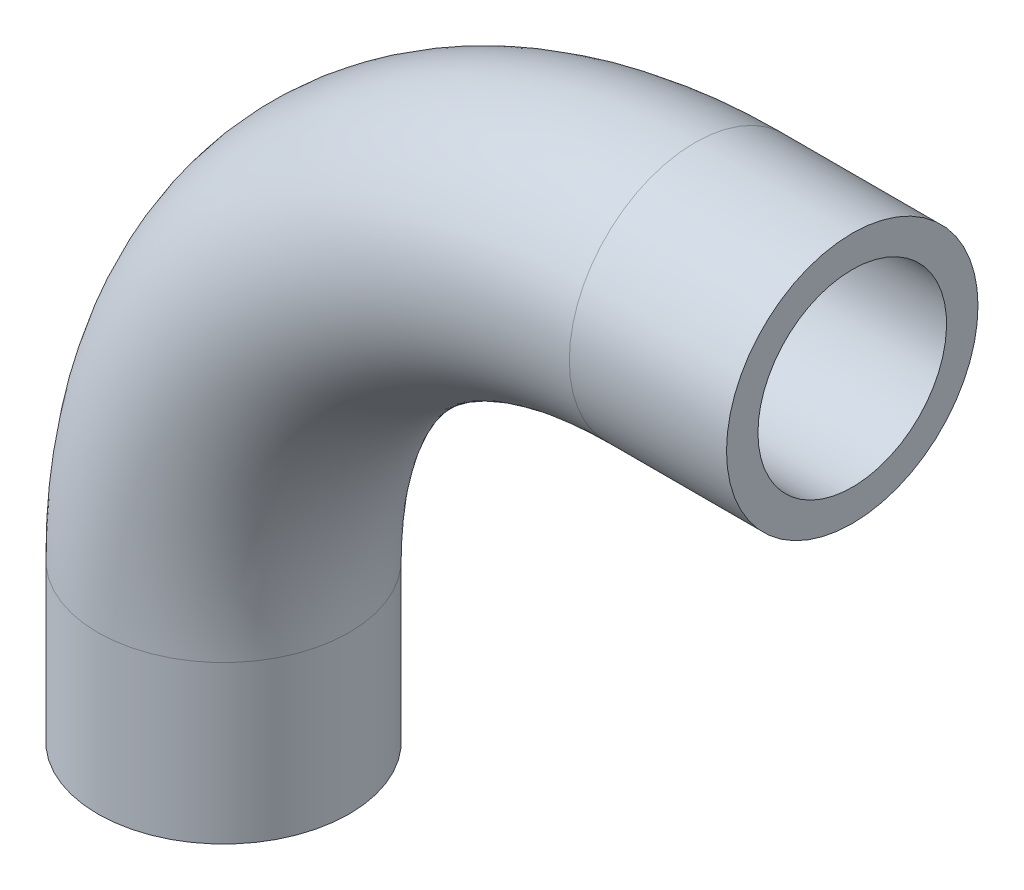
ISO-10303-21;
HEADER;
FILE_DESCRIPTION(('STEP AP214'),'2;1');
FILE_NAME('part.step','',(''),(''),'','','');
FILE_SCHEMA(('AUTOMOTIVE_DESIGN { 1 0 10303 214 1 1 1 1 }'));
ENDSEC;
DATA;
#1=APPLICATION_CONTEXT('core data for automotive mechanical design processes');
#2=APPLICATION_PROTOCOL_DEFINITION('international standard','automotive_design',2000,#1);
#3=PRODUCT_CONTEXT('',#1,'mechanical');
#4=PRODUCT('Part','Part','',(#3));
#5=PRODUCT_RELATED_PRODUCT_CATEGORY('part','',(#4));
#6=PRODUCT_DEFINITION_FORMATION('','',#4);
#7=PRODUCT_DEFINITION_CONTEXT('part definition',#1,'design');
#8=PRODUCT_DEFINITION('design','',#6,#7);
#9=PRODUCT_DEFINITION_SHAPE('','',#8);
#10=(LENGTH_UNIT() NAMED_UNIT(*) SI_UNIT(.MILLI.,.METRE.));
#11=(NAMED_UNIT(*) PLANE_ANGLE_UNIT() SI_UNIT($,.RADIAN.));
#12=(NAMED_UNIT(*) SI_UNIT($,.STERADIAN.) SOLID_ANGLE_UNIT());
#13=UNCERTAINTY_MEASURE_WITH_UNIT(LENGTH_MEASURE(1.E-05),#10,'distance_accuracy_value','');
#14=(GEOMETRIC_REPRESENTATION_CONTEXT(3) GLOBAL_UNCERTAINTY_ASSIGNED_CONTEXT((#13)) GLOBAL_UNIT_ASSIGNED_CONTEXT((#10,
#11,#12)) REPRESENTATION_CONTEXT('',''));
#15=CARTESIAN_POINT('',(0.,0.,0.));
#16=DIRECTION('',(0.,0.,1.));
#17=DIRECTION('',(1.,0.,0.));
#18=AXIS2_PLACEMENT_3D('',#15,#16,#17);
#19=CARTESIAN_POINT('',(0.,0.,0.));
#20=DIRECTION('',(0.,1.,0.));
#21=DIRECTION('',(0.,0.,1.));
#22=AXIS2_PLACEMENT_3D('',#19,#20,#21);
#23=CYLINDRICAL_SURFACE('',#22,4.);
#24=CARTESIAN_POINT('',(0.,4.99999999999999,0.));
#25=DIRECTION('',(0.,1.,0.));
#26=DIRECTION('',(0.,0.,1.));
#27=AXIS2_PLACEMENT_3D('',#24,#25,#26);
#28=CIRCLE('',#27,4.);
#29=CARTESIAN_POINT('',(-4.,4.99999999999999,0.));
#30=VERTEX_POINT('',#29);
#31=EDGE_CURVE('E78',#30,#30,#28,.T.);
#32=ORIENTED_EDGE('',*,*,#31,.F.);
#33=EDGE_LOOP('',(#32));
#34=FACE_BOUND('',#33,.T.);
#35=CARTESIAN_POINT('',(0.,0.,0.));
#36=DIRECTION('',(0.,1.,0.));
#37=DIRECTION('',(0.,0.,1.));
#38=AXIS2_PLACEMENT_3D('',#35,#36,#37);
#39=CIRCLE('',#38,4.);
#40=CARTESIAN_POINT('',(0.,0.,4.));
#41=VERTEX_POINT('',#40);
#42=EDGE_CURVE('E47',#41,#41,#39,.T.);
#43=ORIENTED_EDGE('',*,*,#42,.T.);
#44=EDGE_LOOP('',(#43));
#45=FACE_BOUND('',#44,.T.);
#46=ADVANCED_FACE('F32',(#34,#45),#23,.T.);
#47=CARTESIAN_POINT('',(15.,4.99999999999999,0.));
#48=DIRECTION('',(0.,0.,-1.));
#49=DIRECTION('',(-1.,0.,0.));
#50=AXIS2_PLACEMENT_3D('',#47,#48,#49);
#51=TOROIDAL_SURFACE('',#50,15.,4.);
#52=CARTESIAN_POINT('',(15.,20.,0.));
#53=DIRECTION('',(1.,0.,0.));
#54=DIRECTION('',(0.,0.,1.));
#55=AXIS2_PLACEMENT_3D('',#52,#53,#54);
#56=CIRCLE('',#55,4.);
#57=CARTESIAN_POINT('',(15.,24.,0.));
#58=VERTEX_POINT('',#57);
#59=EDGE_CURVE('E36',#58,#58,#56,.T.);
#60=CARTESIAN_POINT('',(15.,4.99999999999999,0.));
#61=DIRECTION('',(0.,0.,-1.));
#62=DIRECTION('',(-1.,0.,0.));
#63=AXIS2_PLACEMENT_3D('',#60,#61,#62);
#64=CIRCLE('',#63,19.);
#65=EDGE_CURVE('',#30,#58,#64,.T.);
#66=ORIENTED_EDGE('',*,*,#31,.T.);
#67=ORIENTED_EDGE('',*,*,#59,.F.);
#68=ORIENTED_EDGE('',*,*,#65,.T.);
#69=ORIENTED_EDGE('',*,*,#65,.F.);
#70=EDGE_LOOP('',(#66,#68,#67,#69));
#71=FACE_BOUND('',#70,.T.);
#72=ADVANCED_FACE('F86',(#71),#51,.T.);
#73=CARTESIAN_POINT('',(15.,20.,0.));
#74=DIRECTION('',(1.,0.,0.));
#75=DIRECTION('',(0.,1.,0.));
#76=AXIS2_PLACEMENT_3D('',#73,#74,#75);
#77=CYLINDRICAL_SURFACE('',#76,4.);
#78=CARTESIAN_POINT('',(20.,20.,0.));
#79=DIRECTION('',(1.,0.,0.));
#80=DIRECTION('',(0.,0.,1.));
#81=AXIS2_PLACEMENT_3D('',#78,#79,#80);
#82=CIRCLE('',#81,4.);
#83=CARTESIAN_POINT('',(20.,20.,4.));
#84=VERTEX_POINT('',#83);
#85=EDGE_CURVE('E52',#84,#84,#82,.T.);
#86=ORIENTED_EDGE('',*,*,#85,.F.);
#87=EDGE_LOOP('',(#86));
#88=FACE_BOUND('',#87,.T.);
#89=ORIENTED_EDGE('',*,*,#59,.T.);
#90=EDGE_LOOP('',(#89));
#91=FACE_BOUND('',#90,.T.);
#92=ADVANCED_FACE('F34',(#88,#91),#77,.T.);
#93=CARTESIAN_POINT('',(0.,0.,0.));
#94=DIRECTION('',(0.,1.,0.));
#95=DIRECTION('',(0.,0.,1.));
#96=AXIS2_PLACEMENT_3D('',#93,#94,#95);
#97=PLANE('',#96);
#98=CARTESIAN_POINT('',(0.,0.,0.));
#99=DIRECTION('',(0.,1.,0.));
#100=DIRECTION('',(0.,0.,1.));
#101=AXIS2_PLACEMENT_3D('',#98,#99,#100);
#102=CIRCLE('',#101,3.);
#103=CARTESIAN_POINT('',(0.,0.,3.));
#104=VERTEX_POINT('',#103);
#105=EDGE_CURVE('E73',#104,#104,#102,.F.);
#106=ORIENTED_EDGE('',*,*,#105,.F.);
#107=EDGE_LOOP('',(#106));
#108=FACE_BOUND('',#107,.T.);
#109=ORIENTED_EDGE('',*,*,#42,.F.);
#110=EDGE_LOOP('',(#109));
#111=FACE_BOUND('',#110,.T.);
#112=ADVANCED_FACE('F92',(#108,#111),#97,.F.);
#113=CARTESIAN_POINT('',(20.,20.,0.));
#114=DIRECTION('',(1.,0.,0.));
#115=DIRECTION('',(0.,0.,1.));
#116=AXIS2_PLACEMENT_3D('',#113,#114,#115);
#117=PLANE('',#116);
#118=CARTESIAN_POINT('',(20.,20.,0.));
#119=DIRECTION('',(1.,0.,0.));
#120=DIRECTION('',(0.,0.,1.));
#121=AXIS2_PLACEMENT_3D('',#118,#119,#120);
#122=CIRCLE('',#121,3.);
#123=CARTESIAN_POINT('',(20.,20.,3.));
#124=VERTEX_POINT('',#123);
#125=EDGE_CURVE('E11',#124,#124,#122,.F.);
#126=ORIENTED_EDGE('',*,*,#125,.T.);
#127=EDGE_LOOP('',(#126));
#128=FACE_BOUND('',#127,.T.);
#129=ORIENTED_EDGE('',*,*,#85,.T.);
#130=EDGE_LOOP('',(#129));
#131=FACE_BOUND('',#130,.T.);
#132=ADVANCED_FACE('F59',(#128,#131),#117,.T.);
#133=CARTESIAN_POINT('',(0.,0.,0.));
#134=DIRECTION('',(0.,1.,0.));
#135=DIRECTION('',(0.,0.,1.));
#136=AXIS2_PLACEMENT_3D('',#133,#134,#135);
#137=CYLINDRICAL_SURFACE('',#136,3.);
#138=CARTESIAN_POINT('',(0.,4.99999999999999,0.));
#139=DIRECTION('',(0.,1.,0.));
#140=DIRECTION('',(0.,0.,1.));
#141=AXIS2_PLACEMENT_3D('',#138,#139,#140);
#142=CIRCLE('',#141,3.);
#143=CARTESIAN_POINT('',(-3.,4.99999999999999,0.));
#144=VERTEX_POINT('',#143);
#145=EDGE_CURVE('E70',#144,#144,#142,.F.);
#146=ORIENTED_EDGE('',*,*,#145,.F.);
#147=EDGE_LOOP('',(#146));
#148=FACE_BOUND('',#147,.T.);
#149=ORIENTED_EDGE('',*,*,#105,.T.);
#150=EDGE_LOOP('',(#149));
#151=FACE_BOUND('',#150,.T.);
#152=ADVANCED_FACE('F100',(#148,#151),#137,.F.);
#153=CARTESIAN_POINT('',(15.,4.99999999999999,0.));
#154=DIRECTION('',(0.,0.,-1.));
#155=DIRECTION('',(-1.,0.,0.));
#156=AXIS2_PLACEMENT_3D('',#153,#154,#155);
#157=TOROIDAL_SURFACE('',#156,15.,3.);
#158=CARTESIAN_POINT('',(15.,20.,0.));
#159=DIRECTION('',(1.,0.,0.));
#160=DIRECTION('',(0.,0.,1.));
#161=AXIS2_PLACEMENT_3D('',#158,#159,#160);
#162=CIRCLE('',#161,3.);
#163=CARTESIAN_POINT('',(15.,23.,0.));
#164=VERTEX_POINT('',#163);
#165=EDGE_CURVE('E41',#164,#164,#162,.F.);
#166=CARTESIAN_POINT('',(15.,4.99999999999999,0.));
#167=DIRECTION('',(0.,0.,-1.));
#168=DIRECTION('',(-1.,0.,0.));
#169=AXIS2_PLACEMENT_3D('',#166,#167,#168);
#170=CIRCLE('',#169,18.);
#171=EDGE_CURVE('',#144,#164,#170,.T.);
#172=ORIENTED_EDGE('',*,*,#145,.T.);
#173=ORIENTED_EDGE('',*,*,#165,.F.);
#174=ORIENTED_EDGE('',*,*,#171,.T.);
#175=ORIENTED_EDGE('',*,*,#171,.F.);
#176=EDGE_LOOP('',(#172,#174,#173,#175));
#177=FACE_BOUND('',#176,.T.);
#178=ADVANCED_FACE('F65',(#177),#157,.F.);
#179=CARTESIAN_POINT('',(15.,20.,0.));
#180=DIRECTION('',(1.,0.,0.));
#181=DIRECTION('',(0.,1.,0.));
#182=AXIS2_PLACEMENT_3D('',#179,#180,#181);
#183=CYLINDRICAL_SURFACE('',#182,3.);
#184=ORIENTED_EDGE('',*,*,#125,.F.);
#185=EDGE_LOOP('',(#184));
#186=FACE_BOUND('',#185,.T.);
#187=ORIENTED_EDGE('',*,*,#165,.T.);
#188=EDGE_LOOP('',(#187));
#189=FACE_BOUND('',#188,.T.);
#190=ADVANCED_FACE('F62',(#186,#189),#183,.F.);
#191=CLOSED_SHELL('',(#46,#72,#92,#112,#132,#152,#178,#190));
#192=MANIFOLD_SOLID_BREP('B2',#191);
#193=ADVANCED_BREP_SHAPE_REPRESENTATION('',(#18,#192),#14);
#194=SHAPE_DEFINITION_REPRESENTATION(#9,#193);
ENDSEC;
END-ISO-10303-21;
